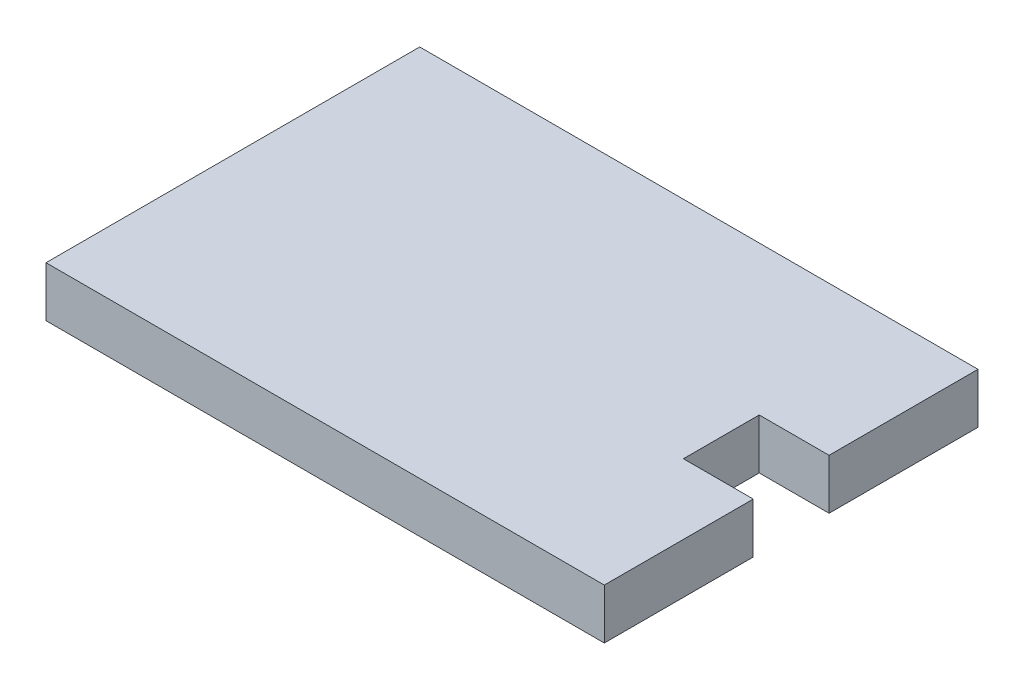
ISO-10303-21;
HEADER;
FILE_DESCRIPTION(('STEP AP214'),'2;1');
FILE_NAME('part.step','',(''),(''),'','','');
FILE_SCHEMA(('AUTOMOTIVE_DESIGN { 1 0 10303 214 1 1 1 1 }'));
ENDSEC;
DATA;
#1=APPLICATION_CONTEXT('core data for automotive mechanical design processes');
#2=APPLICATION_PROTOCOL_DEFINITION('international standard','automotive_design',2000,#1);
#3=PRODUCT_CONTEXT('',#1,'mechanical');
#4=PRODUCT('Part','Part','',(#3));
#5=PRODUCT_RELATED_PRODUCT_CATEGORY('part','',(#4));
#6=PRODUCT_DEFINITION_FORMATION('','',#4);
#7=PRODUCT_DEFINITION_CONTEXT('part definition',#1,'design');
#8=PRODUCT_DEFINITION('design','',#6,#7);
#9=PRODUCT_DEFINITION_SHAPE('','',#8);
#10=(LENGTH_UNIT() NAMED_UNIT(*) SI_UNIT(.MILLI.,.METRE.));
#11=(NAMED_UNIT(*) PLANE_ANGLE_UNIT() SI_UNIT($,.RADIAN.));
#12=(NAMED_UNIT(*) SI_UNIT($,.STERADIAN.) SOLID_ANGLE_UNIT());
#13=UNCERTAINTY_MEASURE_WITH_UNIT(LENGTH_MEASURE(1.E-05),#10,'distance_accuracy_value','');
#14=(GEOMETRIC_REPRESENTATION_CONTEXT(3) GLOBAL_UNCERTAINTY_ASSIGNED_CONTEXT((#13)) GLOBAL_UNIT_ASSIGNED_CONTEXT((#10,
#11,#12)) REPRESENTATION_CONTEXT('',''));
#15=CARTESIAN_POINT('',(0.,0.,0.));
#16=DIRECTION('',(0.,0.,1.));
#17=DIRECTION('',(1.,0.,0.));
#18=AXIS2_PLACEMENT_3D('',#15,#16,#17);
#19=CARTESIAN_POINT('',(100.04,18.,13.59));
#20=DIRECTION('',(-1.,0.,0.));
#21=DIRECTION('',(0.,0.,1.));
#22=AXIS2_PLACEMENT_3D('',#19,#20,#21);
#23=PLANE('',#22);
#24=DIRECTION('',(0.,0.,-1.));
#25=VECTOR('',#24,1.);
#26=CARTESIAN_POINT('',(100.04,0.,13.59));
#27=LINE('',#26,#25);
#28=CARTESIAN_POINT('',(100.04,0.,66.96));
#29=VERTEX_POINT('',#28);
#30=CARTESIAN_POINT('',(100.04,0.,13.59));
#31=VERTEX_POINT('',#30);
#32=EDGE_CURVE('E137',#29,#31,#27,.T.);
#33=ORIENTED_EDGE('',*,*,#32,.T.);
#34=DIRECTION('',(0.,-1.,0.));
#35=VECTOR('',#34,1.);
#36=CARTESIAN_POINT('',(100.04,18.,13.59));
#37=LINE('',#36,#35);
#38=CARTESIAN_POINT('',(100.04,18.,13.59));
#39=VERTEX_POINT('',#38);
#40=EDGE_CURVE('E11',#39,#31,#37,.T.);
#41=ORIENTED_EDGE('',*,*,#40,.F.);
#42=DIRECTION('',(0.,0.,-1.));
#43=VECTOR('',#42,1.);
#44=CARTESIAN_POINT('',(100.04,18.,13.59));
#45=LINE('',#44,#43);
#46=CARTESIAN_POINT('',(100.04,18.,66.96));
#47=VERTEX_POINT('',#46);
#48=EDGE_CURVE('E151',#47,#39,#45,.T.);
#49=ORIENTED_EDGE('',*,*,#48,.F.);
#50=DIRECTION('',(0.,-1.,0.));
#51=VECTOR('',#50,1.);
#52=CARTESIAN_POINT('',(100.04,18.,66.96));
#53=LINE('',#52,#51);
#54=EDGE_CURVE('E133',#47,#29,#53,.T.);
#55=ORIENTED_EDGE('',*,*,#54,.T.);
#56=EDGE_LOOP('',(#33,#41,#49,#55));
#57=FACE_BOUND('',#56,.T.);
#58=ADVANCED_FACE('F41',(#57),#23,.F.);
#59=CARTESIAN_POINT('',(75.01,18.,13.59));
#60=DIRECTION('',(0.,0.,1.));
#61=DIRECTION('',(1.,0.,0.));
#62=AXIS2_PLACEMENT_3D('',#59,#60,#61);
#63=PLANE('',#62);
#64=DIRECTION('',(-1.,0.,0.));
#65=VECTOR('',#64,1.);
#66=CARTESIAN_POINT('',(75.01,0.,13.59));
#67=LINE('',#66,#65);
#68=CARTESIAN_POINT('',(75.01,0.,13.59));
#69=VERTEX_POINT('',#68);
#70=EDGE_CURVE('E140',#31,#69,#67,.T.);
#71=ORIENTED_EDGE('',*,*,#70,.T.);
#72=DIRECTION('',(0.,-1.,0.));
#73=VECTOR('',#72,1.);
#74=CARTESIAN_POINT('',(75.01,18.,13.59));
#75=LINE('',#74,#73);
#76=CARTESIAN_POINT('',(75.01,18.,13.59));
#77=VERTEX_POINT('',#76);
#78=EDGE_CURVE('E49',#77,#69,#75,.T.);
#79=ORIENTED_EDGE('',*,*,#78,.F.);
#80=DIRECTION('',(-1.,0.,0.));
#81=VECTOR('',#80,1.);
#82=CARTESIAN_POINT('',(75.01,18.,13.59));
#83=LINE('',#82,#81);
#84=EDGE_CURVE('E100',#39,#77,#83,.T.);
#85=ORIENTED_EDGE('',*,*,#84,.F.);
#86=ORIENTED_EDGE('',*,*,#40,.T.);
#87=EDGE_LOOP('',(#71,#79,#85,#86));
#88=FACE_BOUND('',#87,.T.);
#89=ADVANCED_FACE('F186',(#88),#63,.F.);
#90=CARTESIAN_POINT('',(75.01,18.,-13.59));
#91=DIRECTION('',(-1.,0.,0.));
#92=DIRECTION('',(0.,0.,1.));
#93=AXIS2_PLACEMENT_3D('',#90,#91,#92);
#94=PLANE('',#93);
#95=DIRECTION('',(0.,0.,-1.));
#96=VECTOR('',#95,1.);
#97=CARTESIAN_POINT('',(75.01,0.,-13.59));
#98=LINE('',#97,#96);
#99=CARTESIAN_POINT('',(75.01,0.,-13.59));
#100=VERTEX_POINT('',#99);
#101=EDGE_CURVE('E142',#69,#100,#98,.T.);
#102=ORIENTED_EDGE('',*,*,#101,.T.);
#103=DIRECTION('',(0.,-1.,0.));
#104=VECTOR('',#103,1.);
#105=CARTESIAN_POINT('',(75.01,18.,-13.59));
#106=LINE('',#105,#104);
#107=CARTESIAN_POINT('',(75.01,18.,-13.59));
#108=VERTEX_POINT('',#107);
#109=EDGE_CURVE('E158',#108,#100,#106,.T.);
#110=ORIENTED_EDGE('',*,*,#109,.F.);
#111=DIRECTION('',(0.,0.,-1.));
#112=VECTOR('',#111,1.);
#113=CARTESIAN_POINT('',(75.01,18.,-13.59));
#114=LINE('',#113,#112);
#115=EDGE_CURVE('E166',#77,#108,#114,.T.);
#116=ORIENTED_EDGE('',*,*,#115,.F.);
#117=ORIENTED_EDGE('',*,*,#78,.T.);
#118=EDGE_LOOP('',(#102,#110,#116,#117));
#119=FACE_BOUND('',#118,.T.);
#120=ADVANCED_FACE('F164',(#119),#94,.F.);
#121=CARTESIAN_POINT('',(75.01,18.,-13.59));
#122=DIRECTION('',(0.,0.,-1.));
#123=DIRECTION('',(-1.,0.,0.));
#124=AXIS2_PLACEMENT_3D('',#121,#122,#123);
#125=PLANE('',#124);
#126=DIRECTION('',(1.,0.,0.));
#127=VECTOR('',#126,1.);
#128=CARTESIAN_POINT('',(75.01,0.,-13.59));
#129=LINE('',#128,#127);
#130=CARTESIAN_POINT('',(100.04,0.,-13.59));
#131=VERTEX_POINT('',#130);
#132=EDGE_CURVE('E144',#100,#131,#129,.T.);
#133=ORIENTED_EDGE('',*,*,#132,.T.);
#134=DIRECTION('',(0.,-1.,0.));
#135=VECTOR('',#134,1.);
#136=CARTESIAN_POINT('',(100.04,18.,-13.59));
#137=LINE('',#136,#135);
#138=CARTESIAN_POINT('',(100.04,18.,-13.59));
#139=VERTEX_POINT('',#138);
#140=EDGE_CURVE('E155',#139,#131,#137,.T.);
#141=ORIENTED_EDGE('',*,*,#140,.F.);
#142=DIRECTION('',(1.,0.,0.));
#143=VECTOR('',#142,1.);
#144=CARTESIAN_POINT('',(75.01,18.,-13.59));
#145=LINE('',#144,#143);
#146=EDGE_CURVE('E178',#108,#139,#145,.T.);
#147=ORIENTED_EDGE('',*,*,#146,.F.);
#148=ORIENTED_EDGE('',*,*,#109,.T.);
#149=EDGE_LOOP('',(#133,#141,#147,#148));
#150=FACE_BOUND('',#149,.T.);
#151=ADVANCED_FACE('F174',(#150),#125,.F.);
#152=CARTESIAN_POINT('',(100.04,18.,-66.96));
#153=DIRECTION('',(-1.,0.,0.));
#154=DIRECTION('',(0.,0.,1.));
#155=AXIS2_PLACEMENT_3D('',#152,#153,#154);
#156=PLANE('',#155);
#157=DIRECTION('',(0.,0.,-1.));
#158=VECTOR('',#157,1.);
#159=CARTESIAN_POINT('',(100.04,0.,-66.96));
#160=LINE('',#159,#158);
#161=CARTESIAN_POINT('',(100.04,0.,-66.96));
#162=VERTEX_POINT('',#161);
#163=EDGE_CURVE('E146',#131,#162,#160,.T.);
#164=ORIENTED_EDGE('',*,*,#163,.T.);
#165=DIRECTION('',(0.,-1.,0.));
#166=VECTOR('',#165,1.);
#167=CARTESIAN_POINT('',(100.04,18.,-66.96));
#168=LINE('',#167,#166);
#169=CARTESIAN_POINT('',(100.04,18.,-66.96));
#170=VERTEX_POINT('',#169);
#171=EDGE_CURVE('E128',#170,#162,#168,.T.);
#172=ORIENTED_EDGE('',*,*,#171,.F.);
#173=DIRECTION('',(0.,0.,-1.));
#174=VECTOR('',#173,1.);
#175=CARTESIAN_POINT('',(100.04,18.,-66.96));
#176=LINE('',#175,#174);
#177=EDGE_CURVE('E119',#139,#170,#176,.T.);
#178=ORIENTED_EDGE('',*,*,#177,.F.);
#179=ORIENTED_EDGE('',*,*,#140,.T.);
#180=EDGE_LOOP('',(#164,#172,#178,#179));
#181=FACE_BOUND('',#180,.T.);
#182=ADVANCED_FACE('F177',(#181),#156,.F.);
#183=CARTESIAN_POINT('',(-100.04,18.,-66.96));
#184=DIRECTION('',(0.,0.,1.));
#185=DIRECTION('',(1.,0.,0.));
#186=AXIS2_PLACEMENT_3D('',#183,#184,#185);
#187=PLANE('',#186);
#188=DIRECTION('',(-1.,0.,0.));
#189=VECTOR('',#188,1.);
#190=CARTESIAN_POINT('',(-100.04,0.,-66.96));
#191=LINE('',#190,#189);
#192=CARTESIAN_POINT('',(-100.04,0.,-66.96));
#193=VERTEX_POINT('',#192);
#194=EDGE_CURVE('E127',#162,#193,#191,.T.);
#195=ORIENTED_EDGE('',*,*,#194,.T.);
#196=DIRECTION('',(0.,-1.,0.));
#197=VECTOR('',#196,1.);
#198=CARTESIAN_POINT('',(-100.04,18.,-66.96));
#199=LINE('',#198,#197);
#200=CARTESIAN_POINT('',(-100.04,18.,-66.96));
#201=VERTEX_POINT('',#200);
#202=EDGE_CURVE('E124',#201,#193,#199,.T.);
#203=ORIENTED_EDGE('',*,*,#202,.F.);
#204=DIRECTION('',(-1.,0.,0.));
#205=VECTOR('',#204,1.);
#206=CARTESIAN_POINT('',(-100.04,18.,-66.96));
#207=LINE('',#206,#205);
#208=EDGE_CURVE('E113',#170,#201,#207,.T.);
#209=ORIENTED_EDGE('',*,*,#208,.F.);
#210=ORIENTED_EDGE('',*,*,#171,.T.);
#211=EDGE_LOOP('',(#195,#203,#209,#210));
#212=FACE_BOUND('',#211,.T.);
#213=ADVANCED_FACE('F125',(#212),#187,.F.);
#214=CARTESIAN_POINT('',(-100.04,18.,-66.96));
#215=DIRECTION('',(1.,0.,0.));
#216=DIRECTION('',(0.,0.,-1.));
#217=AXIS2_PLACEMENT_3D('',#214,#215,#216);
#218=PLANE('',#217);
#219=DIRECTION('',(0.,0.,1.));
#220=VECTOR('',#219,1.);
#221=CARTESIAN_POINT('',(-100.04,0.,-66.96));
#222=LINE('',#221,#220);
#223=CARTESIAN_POINT('',(-100.04,0.,66.96));
#224=VERTEX_POINT('',#223);
#225=EDGE_CURVE('E86',#193,#224,#222,.T.);
#226=ORIENTED_EDGE('',*,*,#225,.T.);
#227=DIRECTION('',(0.,-1.,0.));
#228=VECTOR('',#227,1.);
#229=CARTESIAN_POINT('',(-100.04,18.,66.96));
#230=LINE('',#229,#228);
#231=CARTESIAN_POINT('',(-100.04,18.,66.96));
#232=VERTEX_POINT('',#231);
#233=EDGE_CURVE('E129',#232,#224,#230,.T.);
#234=ORIENTED_EDGE('',*,*,#233,.F.);
#235=DIRECTION('',(0.,0.,1.));
#236=VECTOR('',#235,1.);
#237=CARTESIAN_POINT('',(-100.04,18.,-66.96));
#238=LINE('',#237,#236);
#239=EDGE_CURVE('E117',#201,#232,#238,.T.);
#240=ORIENTED_EDGE('',*,*,#239,.F.);
#241=ORIENTED_EDGE('',*,*,#202,.T.);
#242=EDGE_LOOP('',(#226,#234,#240,#241));
#243=FACE_BOUND('',#242,.T.);
#244=ADVANCED_FACE('F131',(#243),#218,.F.);
#245=CARTESIAN_POINT('',(-100.04,18.,66.96));
#246=DIRECTION('',(0.,0.,-1.));
#247=DIRECTION('',(-1.,0.,0.));
#248=AXIS2_PLACEMENT_3D('',#245,#246,#247);
#249=PLANE('',#248);
#250=DIRECTION('',(1.,0.,0.));
#251=VECTOR('',#250,1.);
#252=CARTESIAN_POINT('',(-100.04,0.,66.96));
#253=LINE('',#252,#251);
#254=EDGE_CURVE('E92',#224,#29,#253,.T.);
#255=ORIENTED_EDGE('',*,*,#254,.T.);
#256=ORIENTED_EDGE('',*,*,#54,.F.);
#257=DIRECTION('',(1.,0.,0.));
#258=VECTOR('',#257,1.);
#259=CARTESIAN_POINT('',(-100.04,18.,66.96));
#260=LINE('',#259,#258);
#261=EDGE_CURVE('E57',#232,#47,#260,.T.);
#262=ORIENTED_EDGE('',*,*,#261,.F.);
#263=ORIENTED_EDGE('',*,*,#233,.T.);
#264=EDGE_LOOP('',(#255,#256,#262,#263));
#265=FACE_BOUND('',#264,.T.);
#266=ADVANCED_FACE('F202',(#265),#249,.F.);
#267=CARTESIAN_POINT('',(0.,18.,0.));
#268=DIRECTION('',(0.,1.,0.));
#269=DIRECTION('',(0.,0.,1.));
#270=AXIS2_PLACEMENT_3D('',#267,#268,#269);
#271=PLANE('',#270);
#272=ORIENTED_EDGE('',*,*,#48,.T.);
#273=ORIENTED_EDGE('',*,*,#84,.T.);
#274=ORIENTED_EDGE('',*,*,#115,.T.);
#275=ORIENTED_EDGE('',*,*,#146,.T.);
#276=ORIENTED_EDGE('',*,*,#177,.T.);
#277=ORIENTED_EDGE('',*,*,#208,.T.);
#278=ORIENTED_EDGE('',*,*,#239,.T.);
#279=ORIENTED_EDGE('',*,*,#261,.T.);
#280=EDGE_LOOP('',(#272,#273,#274,#275,#276,#277,#278,#279));
#281=FACE_BOUND('',#280,.T.);
#282=ADVANCED_FACE('F115',(#281),#271,.T.);
#283=CARTESIAN_POINT('',(0.,0.,0.));
#284=DIRECTION('',(0.,1.,0.));
#285=DIRECTION('',(0.,0.,1.));
#286=AXIS2_PLACEMENT_3D('',#283,#284,#285);
#287=PLANE('',#286);
#288=ORIENTED_EDGE('',*,*,#32,.F.);
#289=ORIENTED_EDGE('',*,*,#254,.F.);
#290=ORIENTED_EDGE('',*,*,#225,.F.);
#291=ORIENTED_EDGE('',*,*,#194,.F.);
#292=ORIENTED_EDGE('',*,*,#163,.F.);
#293=ORIENTED_EDGE('',*,*,#132,.F.);
#294=ORIENTED_EDGE('',*,*,#101,.F.);
#295=ORIENTED_EDGE('',*,*,#70,.F.);
#296=EDGE_LOOP('',(#288,#289,#290,#291,#292,#293,#294,#295));
#297=FACE_BOUND('',#296,.T.);
#298=ADVANCED_FACE('F170',(#297),#287,.F.);
#299=CLOSED_SHELL('',(#58,#89,#120,#151,#182,#213,#244,#266,#282,#298));
#300=MANIFOLD_SOLID_BREP('B2',#299);
#301=ADVANCED_BREP_SHAPE_REPRESENTATION('',(#18,#300),#14);
#302=SHAPE_DEFINITION_REPRESENTATION(#9,#301);
ENDSEC;
END-ISO-10303-21;
